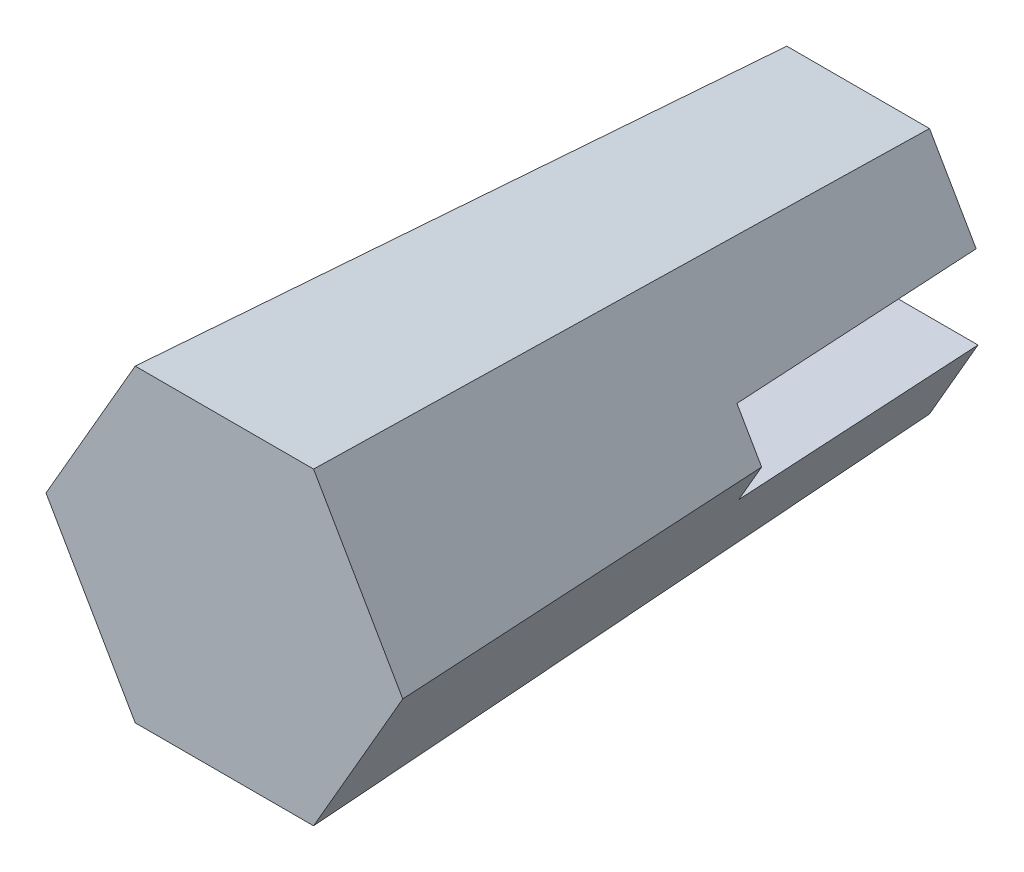
ISO-10303-21;
HEADER;
FILE_DESCRIPTION(('STEP AP214'),'2;1');
FILE_NAME('part.step','',(''),(''),'','','');
FILE_SCHEMA(('AUTOMOTIVE_DESIGN { 1 0 10303 214 1 1 1 1 }'));
ENDSEC;
DATA;
#1=APPLICATION_CONTEXT('core data for automotive mechanical design processes');
#2=APPLICATION_PROTOCOL_DEFINITION('international standard','automotive_design',2000,#1);
#3=PRODUCT_CONTEXT('',#1,'mechanical');
#4=PRODUCT('Part','Part','',(#3));
#5=PRODUCT_RELATED_PRODUCT_CATEGORY('part','',(#4));
#6=PRODUCT_DEFINITION_FORMATION('','',#4);
#7=PRODUCT_DEFINITION_CONTEXT('part definition',#1,'design');
#8=PRODUCT_DEFINITION('design','',#6,#7);
#9=PRODUCT_DEFINITION_SHAPE('','',#8);
#10=(LENGTH_UNIT() NAMED_UNIT(*) SI_UNIT(.MILLI.,.METRE.));
#11=(NAMED_UNIT(*) PLANE_ANGLE_UNIT() SI_UNIT($,.RADIAN.));
#12=(NAMED_UNIT(*) SI_UNIT($,.STERADIAN.) SOLID_ANGLE_UNIT());
#13=UNCERTAINTY_MEASURE_WITH_UNIT(LENGTH_MEASURE(1.E-05),#10,'distance_accuracy_value','');
#14=(GEOMETRIC_REPRESENTATION_CONTEXT(3) GLOBAL_UNCERTAINTY_ASSIGNED_CONTEXT((#13)) GLOBAL_UNIT_ASSIGNED_CONTEXT((#10,
#11,#12)) REPRESENTATION_CONTEXT('',''));
#15=CARTESIAN_POINT('',(0.,0.,0.));
#16=DIRECTION('',(0.,0.,1.));
#17=DIRECTION('',(1.,0.,0.));
#18=AXIS2_PLACEMENT_3D('',#15,#16,#17);
#19=CARTESIAN_POINT('',(0.,0.,0.));
#20=DIRECTION('',(0.,0.,1.));
#21=DIRECTION('',(1.,0.,0.));
#22=AXIS2_PLACEMENT_3D('',#19,#20,#21);
#23=PLANE('',#22);
#24=DIRECTION('',(-0.500000000000001,0.866025403784438,0.));
#25=VECTOR('',#24,1.);
#26=CARTESIAN_POINT('',(11.4384635331849,0.,0.));
#27=LINE('',#26,#25);
#28=CARTESIAN_POINT('',(9.45872946013368,3.42899999999993,0.));
#29=VERTEX_POINT('',#28);
#30=CARTESIAN_POINT('',(5.71923176659241,9.90600000000002,0.));
#31=VERTEX_POINT('',#30);
#32=EDGE_CURVE('E52',#29,#31,#27,.T.);
#33=ORIENTED_EDGE('',*,*,#32,.F.);
#34=DIRECTION('',(1.,0.,0.));
#35=VECTOR('',#34,1.);
#36=CARTESIAN_POINT('',(9.45872946013369,3.42899999999993,0.));
#37=LINE('',#36,#35);
#38=CARTESIAN_POINT('',(-9.45872946013365,3.42899999999993,0.));
#39=VERTEX_POINT('',#38);
#40=EDGE_CURVE('E132',#39,#29,#37,.T.);
#41=ORIENTED_EDGE('',*,*,#40,.F.);
#42=DIRECTION('',(-0.499999999999995,-0.866025403784441,0.));
#43=VECTOR('',#42,1.);
#44=CARTESIAN_POINT('',(-5.71923176659248,9.90599999999998,0.));
#45=LINE('',#44,#43);
#46=CARTESIAN_POINT('',(-5.71923176659248,9.90599999999998,0.));
#47=VERTEX_POINT('',#46);
#48=EDGE_CURVE('E144',#47,#39,#45,.T.);
#49=ORIENTED_EDGE('',*,*,#48,.F.);
#50=DIRECTION('',(-1.,0.,0.));
#51=VECTOR('',#50,1.);
#52=CARTESIAN_POINT('',(5.71923176659241,9.90600000000002,0.));
#53=LINE('',#52,#51);
#54=EDGE_CURVE('E157',#31,#47,#53,.T.);
#55=ORIENTED_EDGE('',*,*,#54,.F.);
#56=EDGE_LOOP('',(#33,#41,#49,#55));
#57=FACE_BOUND('',#56,.T.);
#58=ADVANCED_FACE('F47',(#57),#23,.F.);
#59=DIRECTION('',(0.500000000000007,-0.866025403784435,0.));
#60=VECTOR('',#59,1.);
#61=CARTESIAN_POINT('',(-11.4384635331849,0.,0.));
#62=LINE('',#61,#60);
#63=CARTESIAN_POINT('',(-9.60537642850785,-3.17499999999996,0.));
#64=VERTEX_POINT('',#63);
#65=CARTESIAN_POINT('',(-5.71923176659234,-9.90600000000006,0.));
#66=VERTEX_POINT('',#65);
#67=EDGE_CURVE('E156',#64,#66,#62,.T.);
#68=ORIENTED_EDGE('',*,*,#67,.F.);
#69=DIRECTION('',(-1.,0.,0.));
#70=VECTOR('',#69,1.);
#71=CARTESIAN_POINT('',(-9.60537642850788,-3.17499999999996,0.));
#72=LINE('',#71,#70);
#73=CARTESIAN_POINT('',(9.60537642850787,-3.17499999999996,0.));
#74=VERTEX_POINT('',#73);
#75=EDGE_CURVE('E148',#74,#64,#72,.T.);
#76=ORIENTED_EDGE('',*,*,#75,.F.);
#77=DIRECTION('',(0.499999999999995,0.866025403784442,0.));
#78=VECTOR('',#77,1.);
#79=CARTESIAN_POINT('',(5.71923176659255,-9.90599999999994,0.));
#80=LINE('',#79,#78);
#81=CARTESIAN_POINT('',(5.71923176659255,-9.90599999999994,0.));
#82=VERTEX_POINT('',#81);
#83=EDGE_CURVE('E228',#82,#74,#80,.T.);
#84=ORIENTED_EDGE('',*,*,#83,.F.);
#85=DIRECTION('',(1.,0.,0.));
#86=VECTOR('',#85,1.);
#87=CARTESIAN_POINT('',(-5.71923176659234,-9.90600000000006,0.));
#88=LINE('',#87,#86);
#89=EDGE_CURVE('E198',#66,#82,#88,.T.);
#90=ORIENTED_EDGE('',*,*,#89,.F.);
#91=EDGE_LOOP('',(#68,#76,#84,#90));
#92=FACE_BOUND('',#91,.T.);
#93=ADVANCED_FACE('F49',(#92),#23,.F.);
#94=CARTESIAN_POINT('',(0.,0.,50.8));
#95=DIRECTION('',(0.,0.,1.));
#96=DIRECTION('',(1.,0.,0.));
#97=AXIS2_PLACEMENT_3D('',#94,#95,#96);
#98=PLANE('',#97);
#99=DIRECTION('',(-0.499999999999995,-0.866025403784442,0.));
#100=VECTOR('',#99,1.);
#101=CARTESIAN_POINT('',(-7.1490397082406,12.3825,50.8));
#102=LINE('',#101,#100);
#103=CARTESIAN_POINT('',(-7.1490397082406,12.3825,50.8));
#104=VERTEX_POINT('',#103);
#105=CARTESIAN_POINT('',(-14.2980794164811,-1.04083408558608E-13,50.8));
#106=VERTEX_POINT('',#105);
#107=EDGE_CURVE('E138',#104,#106,#102,.T.);
#108=ORIENTED_EDGE('',*,*,#107,.T.);
#109=DIRECTION('',(0.500000000000007,-0.866025403784435,0.));
#110=VECTOR('',#109,1.);
#111=CARTESIAN_POINT('',(-14.2980794164811,0.,50.8));
#112=LINE('',#111,#110);
#113=CARTESIAN_POINT('',(-7.14903970824043,-12.3825000000001,50.8));
#114=VERTEX_POINT('',#113);
#115=EDGE_CURVE('E236',#106,#114,#112,.T.);
#116=ORIENTED_EDGE('',*,*,#115,.T.);
#117=DIRECTION('',(1.,0.,0.));
#118=VECTOR('',#117,1.);
#119=CARTESIAN_POINT('',(-7.14903970824043,-12.3825000000001,50.8));
#120=LINE('',#119,#118);
#121=CARTESIAN_POINT('',(7.14903970824039,-12.3825000000001,50.8));
#122=VERTEX_POINT('',#121);
#123=EDGE_CURVE('E439',#114,#122,#120,.T.);
#124=ORIENTED_EDGE('',*,*,#123,.T.);
#125=DIRECTION('',(0.5,0.866025403784439,0.));
#126=VECTOR('',#125,1.);
#127=CARTESIAN_POINT('',(7.14903970824039,-12.3825000000001,50.8));
#128=LINE('',#127,#126);
#129=CARTESIAN_POINT('',(14.2980794164807,-5.54735933662894E-13,50.8));
#130=VERTEX_POINT('',#129);
#131=EDGE_CURVE('E446',#122,#130,#128,.T.);
#132=ORIENTED_EDGE('',*,*,#131,.T.);
#133=DIRECTION('',(-0.499999999999963,0.86602540378446,0.));
#134=VECTOR('',#133,1.);
#135=CARTESIAN_POINT('',(14.2980794164807,-5.54735933662894E-13,50.8));
#136=LINE('',#135,#134);
#137=CARTESIAN_POINT('',(7.14903970824052,12.3825,50.8));
#138=VERTEX_POINT('',#137);
#139=EDGE_CURVE('E255',#130,#138,#136,.T.);
#140=ORIENTED_EDGE('',*,*,#139,.T.);
#141=DIRECTION('',(-1.,0.,0.));
#142=VECTOR('',#141,1.);
#143=CARTESIAN_POINT('',(7.14903970824052,12.3825,50.8));
#144=LINE('',#143,#142);
#145=EDGE_CURVE('E253',#138,#104,#144,.T.);
#146=ORIENTED_EDGE('',*,*,#145,.T.);
#147=EDGE_LOOP('',(#108,#116,#124,#132,#140,#146));
#148=FACE_BOUND('',#147,.T.);
#149=ADVANCED_FACE('F178',(#148),#98,.T.);
#150=CARTESIAN_POINT('',(-8.55850782114499,4.94125679439951,-0.481772537453957));
#151=DIRECTION('',(-0.86499815266777,0.499406916291259,-0.0486921743383983));
#152=DIRECTION('',(-0.499999999999995,-0.866025403784442,0.));
#153=AXIS2_PLACEMENT_3D('',#150,#151,#152);
#154=PLANE('',#153);
#155=DIRECTION('',(0.0562026755615711,0.,-0.998419380450781));
#156=VECTOR('',#155,1.);
#157=CARTESIAN_POINT('',(-9.42885178603666,3.42899999999993,-0.53076563638969));
#158=LINE('',#157,#156);
#159=CARTESIAN_POINT('',(-10.6025758134521,3.42899999999993,20.32));
#160=VERTEX_POINT('',#159);
#161=EDGE_CURVE('E129',#160,#39,#158,.T.);
#162=ORIENTED_EDGE('',*,*,#161,.F.);
#163=DIRECTION('',(-0.499999999999995,-0.866025403784442,0.));
#164=VECTOR('',#163,1.);
#165=CARTESIAN_POINT('',(-9.43673241487754,5.44829999999994,20.32));
#166=LINE('',#165,#164);
#167=CARTESIAN_POINT('',(-12.5823098865034,0.,20.32));
#168=VERTEX_POINT('',#167);
#169=EDGE_CURVE('E385',#160,#168,#166,.T.);
#170=ORIENTED_EDGE('',*,*,#169,.T.);
#171=DIRECTION('',(0.0562026755615713,0.,-0.998419380450781));
#172=VECTOR('',#171,1.);
#173=CARTESIAN_POINT('',(-14.2980794164811,0.,50.8));
#174=LINE('',#173,#172);
#175=EDGE_CURVE('E241',#106,#168,#174,.T.);
#176=ORIENTED_EDGE('',*,*,#175,.F.);
#177=ORIENTED_EDGE('',*,*,#107,.F.);
#178=DIRECTION('',(0.0281013377807859,-0.0486729447969754,-0.998419380450781));
#179=VECTOR('',#178,1.);
#180=CARTESIAN_POINT('',(-7.1490397082406,12.3825,50.8));
#181=LINE('',#180,#179);
#182=EDGE_CURVE('E155',#104,#47,#181,.T.);
#183=ORIENTED_EDGE('',*,*,#182,.T.);
#184=ORIENTED_EDGE('',*,*,#48,.T.);
#185=EDGE_LOOP('',(#162,#170,#176,#177,#183,#184));
#186=FACE_BOUND('',#185,.T.);
#187=ADVANCED_FACE('F152',(#186),#154,.T.);
#188=CARTESIAN_POINT('',(-8.55850782114492,-4.94125679439963,-0.481772537453957));
#189=DIRECTION('',(-0.864998152667763,-0.499406916291271,-0.0486921743383982));
#190=DIRECTION('',(0.500000000000007,-0.866025403784434,0.));
#191=AXIS2_PLACEMENT_3D('',#188,#189,#190);
#192=PLANE('',#191);
#193=DIRECTION('',(-0.0562026755615715,0.,0.998419380450781));
#194=VECTOR('',#193,1.);
#195=CARTESIAN_POINT('',(-9.5750355346574,-3.17499999999996,-0.538994560984884));
#196=LINE('',#195,#194);
#197=CARTESIAN_POINT('',(-10.7492227818263,-3.17500000000007,20.32));
#198=VERTEX_POINT('',#197);
#199=EDGE_CURVE('E139',#64,#198,#196,.T.);
#200=ORIENTED_EDGE('',*,*,#199,.F.);
#201=ORIENTED_EDGE('',*,*,#67,.T.);
#202=DIRECTION('',(0.0281013377807852,0.0486729447969758,-0.998419380450781));
#203=VECTOR('',#202,1.);
#204=CARTESIAN_POINT('',(-7.14903970824043,-12.3825000000001,50.8));
#205=LINE('',#204,#203);
#206=EDGE_CURVE('E221',#114,#66,#205,.T.);
#207=ORIENTED_EDGE('',*,*,#206,.F.);
#208=ORIENTED_EDGE('',*,*,#115,.F.);
#209=ORIENTED_EDGE('',*,*,#175,.T.);
#210=DIRECTION('',(0.500000000000007,-0.866025403784434,0.));
#211=VECTOR('',#210,1.);
#212=CARTESIAN_POINT('',(-9.43673241487747,-5.44830000000008,20.32));
#213=LINE('',#212,#211);
#214=EDGE_CURVE('E394',#168,#198,#213,.T.);
#215=ORIENTED_EDGE('',*,*,#214,.T.);
#216=EDGE_LOOP('',(#200,#201,#207,#208,#209,#215));
#217=FACE_BOUND('',#216,.T.);
#218=ADVANCED_FACE('F177',(#217),#192,.T.);
#219=CARTESIAN_POINT('',(0.,9.88251358879912,-0.481772537453957));
#220=DIRECTION('',(0.,0.998813832582528,-0.0486921743383983));
#221=DIRECTION('',(0.,0.0486921743383983,0.998813832582528));
#222=AXIS2_PLACEMENT_3D('',#219,#220,#221);
#223=PLANE('',#222);
#224=DIRECTION('',(-0.0281013377807856,-0.0486729447969756,-0.998419380450781));
#225=VECTOR('',#224,1.);
#226=CARTESIAN_POINT('',(7.14903970824052,12.3825,50.8));
#227=LINE('',#226,#225);
#228=EDGE_CURVE('E247',#138,#31,#227,.T.);
#229=ORIENTED_EDGE('',*,*,#228,.T.);
#230=ORIENTED_EDGE('',*,*,#54,.T.);
#231=ORIENTED_EDGE('',*,*,#182,.F.);
#232=ORIENTED_EDGE('',*,*,#145,.F.);
#233=EDGE_LOOP('',(#229,#230,#231,#232));
#234=FACE_BOUND('',#233,.T.);
#235=ADVANCED_FACE('F279',(#234),#223,.T.);
#236=CARTESIAN_POINT('',(8.55850782114496,4.94125679439958,-0.481772537453836));
#237=DIRECTION('',(0.864998152667767,0.499406916291265,-0.048692174338386));
#238=DIRECTION('',(-0.500000000000001,0.866025403784438,0.));
#239=AXIS2_PLACEMENT_3D('',#236,#237,#238);
#240=PLANE('',#239);
#241=DIRECTION('',(0.0562026755615571,0.,0.998419380450781));
#242=VECTOR('',#241,1.);
#243=CARTESIAN_POINT('',(9.4288517860367,3.42899999999993,-0.530765636389559));
#244=LINE('',#243,#242);
#245=CARTESIAN_POINT('',(10.6025758134519,3.42899999999993,20.32));
#246=VERTEX_POINT('',#245);
#247=EDGE_CURVE('E12',#29,#246,#244,.T.);
#248=ORIENTED_EDGE('',*,*,#247,.F.);
#249=ORIENTED_EDGE('',*,*,#32,.T.);
#250=ORIENTED_EDGE('',*,*,#228,.F.);
#251=ORIENTED_EDGE('',*,*,#139,.F.);
#252=DIRECTION('',(-0.0562026755615634,0.,-0.998419380450781));
#253=VECTOR('',#252,1.);
#254=CARTESIAN_POINT('',(14.2980794164807,-5.54735933662894E-13,50.8));
#255=LINE('',#254,#253);
#256=CARTESIAN_POINT('',(12.5823098865032,-2.13729552684205E-13,20.32));
#257=VERTEX_POINT('',#256);
#258=EDGE_CURVE('E251',#130,#257,#255,.T.);
#259=ORIENTED_EDGE('',*,*,#258,.T.);
#260=DIRECTION('',(-0.500000000000001,0.866025403784438,0.));
#261=VECTOR('',#260,1.);
#262=CARTESIAN_POINT('',(9.43673241487729,5.44829999999989,20.32));
#263=LINE('',#262,#261);
#264=EDGE_CURVE('E66',#257,#246,#263,.T.);
#265=ORIENTED_EDGE('',*,*,#264,.T.);
#266=EDGE_LOOP('',(#248,#249,#250,#251,#259,#265));
#267=FACE_BOUND('',#266,.T.);
#268=ADVANCED_FACE('F271',(#267),#240,.T.);
#269=CARTESIAN_POINT('',(8.55850782114502,-4.94125679439953,-0.481772537453931));
#270=DIRECTION('',(0.86499815266777,-0.499406916291259,-0.0486921743383954));
#271=DIRECTION('',(0.499999999999995,0.866025403784441,0.));
#272=AXIS2_PLACEMENT_3D('',#269,#270,#271);
#273=PLANE('',#272);
#274=DIRECTION('',(-0.0562026755615678,0.,-0.998419380450781));
#275=VECTOR('',#274,1.);
#276=CARTESIAN_POINT('',(9.57503553465742,-3.17499999999996,-0.538994560984849));
#277=LINE('',#276,#275);
#278=CARTESIAN_POINT('',(10.7492227818262,-3.17500000000007,20.32));
#279=VERTEX_POINT('',#278);
#280=EDGE_CURVE('E58',#279,#74,#277,.T.);
#281=ORIENTED_EDGE('',*,*,#280,.F.);
#282=DIRECTION('',(0.499999999999995,0.866025403784441,0.));
#283=VECTOR('',#282,1.);
#284=CARTESIAN_POINT('',(9.43673241487753,-5.44829999999993,20.32));
#285=LINE('',#284,#283);
#286=EDGE_CURVE('E316',#279,#257,#285,.T.);
#287=ORIENTED_EDGE('',*,*,#286,.T.);
#288=ORIENTED_EDGE('',*,*,#258,.F.);
#289=ORIENTED_EDGE('',*,*,#131,.F.);
#290=DIRECTION('',(-0.0281013377807804,0.0486729447969793,-0.998419380450781));
#291=VECTOR('',#290,1.);
#292=CARTESIAN_POINT('',(7.14903970824039,-12.3825000000001,50.8));
#293=LINE('',#292,#291);
#294=EDGE_CURVE('E74',#122,#82,#293,.T.);
#295=ORIENTED_EDGE('',*,*,#294,.T.);
#296=ORIENTED_EDGE('',*,*,#83,.T.);
#297=EDGE_LOOP('',(#281,#287,#288,#289,#295,#296));
#298=FACE_BOUND('',#297,.T.);
#299=ADVANCED_FACE('F211',(#298),#273,.T.);
#300=CARTESIAN_POINT('',(1.01915184907495E-13,-9.88251358879912,-0.481772537453957));
#301=DIRECTION('',(0.,-0.998813832582528,-0.0486921743383982));
#302=DIRECTION('',(0.,0.0486921743383982,-0.998813832582528));
#303=AXIS2_PLACEMENT_3D('',#300,#301,#302);
#304=PLANE('',#303);
#305=ORIENTED_EDGE('',*,*,#206,.T.);
#306=ORIENTED_EDGE('',*,*,#89,.T.);
#307=ORIENTED_EDGE('',*,*,#294,.F.);
#308=ORIENTED_EDGE('',*,*,#123,.F.);
#309=EDGE_LOOP('',(#305,#306,#307,#308));
#310=FACE_BOUND('',#309,.T.);
#311=ADVANCED_FACE('F202',(#310),#304,.T.);
#312=CARTESIAN_POINT('',(9.45872946013369,3.42899999999993,20.32));
#313=DIRECTION('',(0.,1.,0.));
#314=DIRECTION('',(-1.,0.,0.));
#315=AXIS2_PLACEMENT_3D('',#312,#313,#314);
#316=PLANE('',#315);
#317=ORIENTED_EDGE('',*,*,#161,.T.);
#318=ORIENTED_EDGE('',*,*,#40,.T.);
#319=ORIENTED_EDGE('',*,*,#247,.T.);
#320=DIRECTION('',(1.,0.,0.));
#321=VECTOR('',#320,1.);
#322=CARTESIAN_POINT('',(9.45872946013369,3.42899999999993,20.32));
#323=LINE('',#322,#321);
#324=EDGE_CURVE('E134',#160,#246,#323,.T.);
#325=ORIENTED_EDGE('',*,*,#324,.F.);
#326=EDGE_LOOP('',(#317,#318,#319,#325));
#327=FACE_BOUND('',#326,.T.);
#328=ADVANCED_FACE('F131',(#327),#316,.F.);
#329=CARTESIAN_POINT('',(-9.60537642850788,-3.17499999999996,20.32));
#330=DIRECTION('',(0.,-1.,0.));
#331=DIRECTION('',(0.,0.,-1.));
#332=AXIS2_PLACEMENT_3D('',#329,#330,#331);
#333=PLANE('',#332);
#334=ORIENTED_EDGE('',*,*,#199,.T.);
#335=DIRECTION('',(-1.,0.,0.));
#336=VECTOR('',#335,1.);
#337=CARTESIAN_POINT('',(15.6932032954451,-3.17500000000007,20.32));
#338=LINE('',#337,#336);
#339=EDGE_CURVE('E328',#279,#198,#338,.T.);
#340=ORIENTED_EDGE('',*,*,#339,.F.);
#341=ORIENTED_EDGE('',*,*,#280,.T.);
#342=ORIENTED_EDGE('',*,*,#75,.T.);
#343=EDGE_LOOP('',(#334,#340,#341,#342));
#344=FACE_BOUND('',#343,.T.);
#345=ADVANCED_FACE('F325',(#344),#333,.F.);
#346=CARTESIAN_POINT('',(0.,0.,20.32));
#347=DIRECTION('',(0.,0.,-1.));
#348=DIRECTION('',(-1.,0.,0.));
#349=AXIS2_PLACEMENT_3D('',#346,#347,#348);
#350=PLANE('',#349);
#351=ORIENTED_EDGE('',*,*,#324,.T.);
#352=ORIENTED_EDGE('',*,*,#264,.F.);
#353=ORIENTED_EDGE('',*,*,#286,.F.);
#354=ORIENTED_EDGE('',*,*,#339,.T.);
#355=ORIENTED_EDGE('',*,*,#214,.F.);
#356=ORIENTED_EDGE('',*,*,#169,.F.);
#357=EDGE_LOOP('',(#351,#352,#353,#354,#355,#356));
#358=FACE_BOUND('',#357,.T.);
#359=ADVANCED_FACE('F384',(#358),#350,.T.);
#360=CLOSED_SHELL('',(#58,#93,#149,#187,#218,#235,#268,#299,#311,#328,#345,#359));
#361=MANIFOLD_SOLID_BREP('B2',#360);
#362=ADVANCED_BREP_SHAPE_REPRESENTATION('',(#18,#361),#14);
#363=SHAPE_DEFINITION_REPRESENTATION(#9,#362);
ENDSEC;
END-ISO-10303-21;
